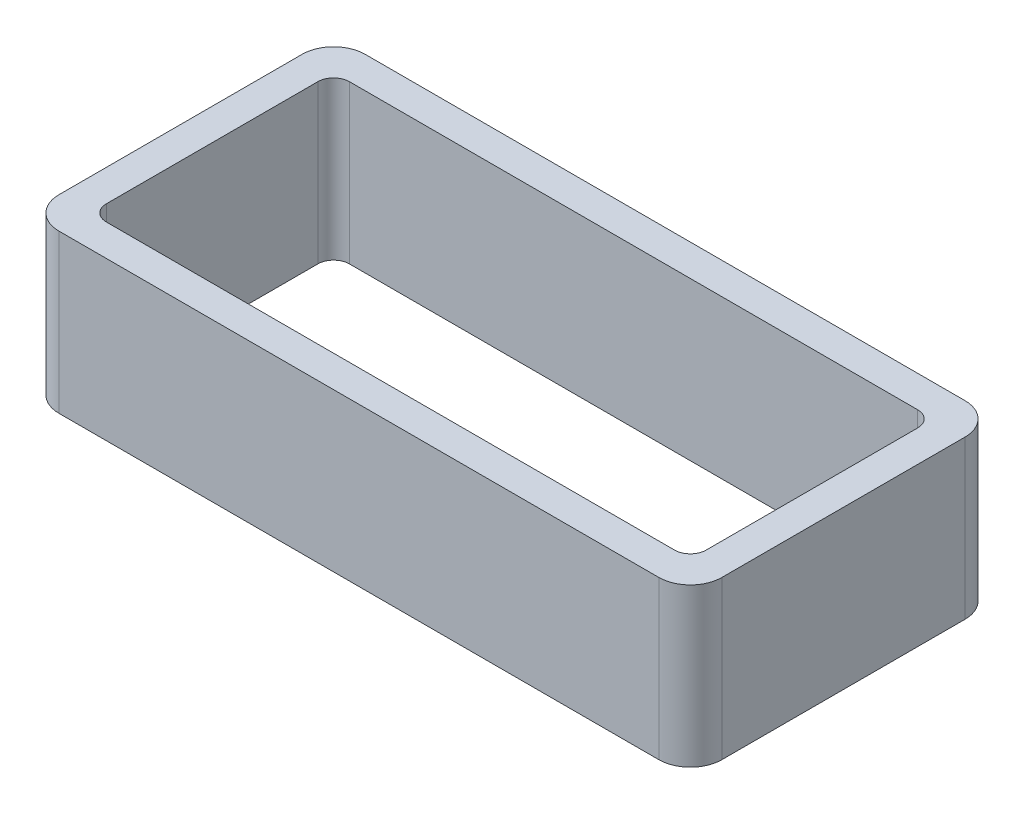
ISO-10303-21;
HEADER;
FILE_DESCRIPTION(('STEP AP214'),'2;1');
FILE_NAME('part.step','',(''),(''),'','','');
FILE_SCHEMA(('AUTOMOTIVE_DESIGN { 1 0 10303 214 1 1 1 1 }'));
ENDSEC;
DATA;
#1=APPLICATION_CONTEXT('core data for automotive mechanical design processes');
#2=APPLICATION_PROTOCOL_DEFINITION('international standard','automotive_design',2000,#1);
#3=PRODUCT_CONTEXT('',#1,'mechanical');
#4=PRODUCT('Part','Part','',(#3));
#5=PRODUCT_RELATED_PRODUCT_CATEGORY('part','',(#4));
#6=PRODUCT_DEFINITION_FORMATION('','',#4);
#7=PRODUCT_DEFINITION_CONTEXT('part definition',#1,'design');
#8=PRODUCT_DEFINITION('design','',#6,#7);
#9=PRODUCT_DEFINITION_SHAPE('','',#8);
#10=(LENGTH_UNIT() NAMED_UNIT(*) SI_UNIT(.MILLI.,.METRE.));
#11=(NAMED_UNIT(*) PLANE_ANGLE_UNIT() SI_UNIT($,.RADIAN.));
#12=(NAMED_UNIT(*) SI_UNIT($,.STERADIAN.) SOLID_ANGLE_UNIT());
#13=UNCERTAINTY_MEASURE_WITH_UNIT(LENGTH_MEASURE(1.E-05),#10,'distance_accuracy_value','');
#14=(GEOMETRIC_REPRESENTATION_CONTEXT(3) GLOBAL_UNCERTAINTY_ASSIGNED_CONTEXT((#13)) GLOBAL_UNIT_ASSIGNED_CONTEXT((#10,
#11,#12)) REPRESENTATION_CONTEXT('',''));
#15=CARTESIAN_POINT('',(0.,0.,0.));
#16=DIRECTION('',(0.,0.,1.));
#17=DIRECTION('',(1.,0.,0.));
#18=AXIS2_PLACEMENT_3D('',#15,#16,#17);
#19=CARTESIAN_POINT('',(9.5,5.,-3.85));
#20=DIRECTION('',(0.,-1.,0.));
#21=DIRECTION('',(0.,0.,-1.));
#22=AXIS2_PLACEMENT_3D('',#19,#20,#21);
#23=PLANE('',#22);
#24=CARTESIAN_POINT('',(9.5,5.,-3.85));
#25=DIRECTION('',(0.,1.,0.));
#26=DIRECTION('',(0.,0.,-1.));
#27=AXIS2_PLACEMENT_3D('',#24,#25,#26);
#28=CIRCLE('',#27,1.);
#29=CARTESIAN_POINT('',(10.5,5.,-3.84999999999999));
#30=VERTEX_POINT('',#29);
#31=CARTESIAN_POINT('',(9.49999999999999,5.,-4.85));
#32=VERTEX_POINT('',#31);
#33=EDGE_CURVE('E213',#30,#32,#28,.T.);
#34=ORIENTED_EDGE('',*,*,#33,.T.);
#35=DIRECTION('',(-1.,0.,0.));
#36=VECTOR('',#35,1.);
#37=CARTESIAN_POINT('',(-9.49999999999999,5.,-4.85));
#38=LINE('',#37,#36);
#39=CARTESIAN_POINT('',(-9.49999999999999,5.,-4.85));
#40=VERTEX_POINT('',#39);
#41=EDGE_CURVE('E216',#32,#40,#38,.T.);
#42=ORIENTED_EDGE('',*,*,#41,.T.);
#43=CARTESIAN_POINT('',(-9.5,5.,-3.85));
#44=DIRECTION('',(0.,1.,0.));
#45=DIRECTION('',(0.,0.,-1.));
#46=AXIS2_PLACEMENT_3D('',#43,#44,#45);
#47=CIRCLE('',#46,1.);
#48=CARTESIAN_POINT('',(-10.5,5.,-3.84999999999999));
#49=VERTEX_POINT('',#48);
#50=EDGE_CURVE('E219',#40,#49,#47,.T.);
#51=ORIENTED_EDGE('',*,*,#50,.T.);
#52=DIRECTION('',(0.,0.,1.));
#53=VECTOR('',#52,1.);
#54=CARTESIAN_POINT('',(-10.5,5.,-3.84999999999999));
#55=LINE('',#54,#53);
#56=CARTESIAN_POINT('',(-10.5,5.,3.84999999999999));
#57=VERTEX_POINT('',#56);
#58=EDGE_CURVE('E221',#49,#57,#55,.T.);
#59=ORIENTED_EDGE('',*,*,#58,.T.);
#60=CARTESIAN_POINT('',(-9.5,5.,3.85));
#61=DIRECTION('',(0.,1.,0.));
#62=DIRECTION('',(0.,0.,-1.));
#63=AXIS2_PLACEMENT_3D('',#60,#61,#62);
#64=CIRCLE('',#63,1.);
#65=CARTESIAN_POINT('',(-9.49999999999999,5.,4.85));
#66=VERTEX_POINT('',#65);
#67=EDGE_CURVE('E223',#57,#66,#64,.T.);
#68=ORIENTED_EDGE('',*,*,#67,.T.);
#69=DIRECTION('',(1.,0.,0.));
#70=VECTOR('',#69,1.);
#71=CARTESIAN_POINT('',(-9.49999999999999,5.,4.85));
#72=LINE('',#71,#70);
#73=CARTESIAN_POINT('',(9.49999999999999,5.,4.85));
#74=VERTEX_POINT('',#73);
#75=EDGE_CURVE('E225',#66,#74,#72,.T.);
#76=ORIENTED_EDGE('',*,*,#75,.T.);
#77=CARTESIAN_POINT('',(9.5,5.,3.85));
#78=DIRECTION('',(0.,1.,0.));
#79=DIRECTION('',(0.,0.,-1.));
#80=AXIS2_PLACEMENT_3D('',#77,#78,#79);
#81=CIRCLE('',#80,1.);
#82=CARTESIAN_POINT('',(10.5,5.,3.84999999999999));
#83=VERTEX_POINT('',#82);
#84=EDGE_CURVE('E227',#74,#83,#81,.T.);
#85=ORIENTED_EDGE('',*,*,#84,.T.);
#86=DIRECTION('',(0.,0.,-1.));
#87=VECTOR('',#86,1.);
#88=CARTESIAN_POINT('',(10.5,5.,-3.84999999999999));
#89=LINE('',#88,#87);
#90=EDGE_CURVE('E229',#83,#30,#89,.T.);
#91=ORIENTED_EDGE('',*,*,#90,.T.);
#92=EDGE_LOOP('',(#34,#42,#51,#59,#68,#76,#85,#91));
#93=FACE_BOUND('',#92,.T.);
#94=CARTESIAN_POINT('',(9.,5.,-3.35));
#95=DIRECTION('',(0.,1.,0.));
#96=DIRECTION('',(0.,0.,-1.));
#97=AXIS2_PLACEMENT_3D('',#94,#95,#96);
#98=CIRCLE('',#97,0.5);
#99=CARTESIAN_POINT('',(9.5,5.,-3.35));
#100=VERTEX_POINT('',#99);
#101=CARTESIAN_POINT('',(8.99999999999999,5.,-3.85));
#102=VERTEX_POINT('',#101);
#103=EDGE_CURVE('E148',#100,#102,#98,.T.);
#104=ORIENTED_EDGE('',*,*,#103,.F.);
#105=DIRECTION('',(0.,0.,-1.));
#106=VECTOR('',#105,1.);
#107=CARTESIAN_POINT('',(9.5,5.,-3.35));
#108=LINE('',#107,#106);
#109=CARTESIAN_POINT('',(9.5,5.,3.35));
#110=VERTEX_POINT('',#109);
#111=EDGE_CURVE('E181',#110,#100,#108,.T.);
#112=ORIENTED_EDGE('',*,*,#111,.F.);
#113=CARTESIAN_POINT('',(9.,5.,3.35));
#114=DIRECTION('',(0.,1.,0.));
#115=DIRECTION('',(0.,0.,-1.));
#116=AXIS2_PLACEMENT_3D('',#113,#114,#115);
#117=CIRCLE('',#116,0.5);
#118=CARTESIAN_POINT('',(8.99999999999999,5.,3.85));
#119=VERTEX_POINT('',#118);
#120=EDGE_CURVE('E179',#119,#110,#117,.T.);
#121=ORIENTED_EDGE('',*,*,#120,.F.);
#122=DIRECTION('',(1.,0.,0.));
#123=VECTOR('',#122,1.);
#124=CARTESIAN_POINT('',(-9.,5.,3.85));
#125=LINE('',#124,#123);
#126=CARTESIAN_POINT('',(-9.,5.,3.85));
#127=VERTEX_POINT('',#126);
#128=EDGE_CURVE('E177',#127,#119,#125,.T.);
#129=ORIENTED_EDGE('',*,*,#128,.F.);
#130=CARTESIAN_POINT('',(-9.,5.,3.35));
#131=DIRECTION('',(0.,1.,0.));
#132=DIRECTION('',(0.,0.,-1.));
#133=AXIS2_PLACEMENT_3D('',#130,#131,#132);
#134=CIRCLE('',#133,0.5);
#135=CARTESIAN_POINT('',(-9.5,5.,3.35));
#136=VERTEX_POINT('',#135);
#137=EDGE_CURVE('E175',#136,#127,#134,.T.);
#138=ORIENTED_EDGE('',*,*,#137,.F.);
#139=DIRECTION('',(0.,0.,1.));
#140=VECTOR('',#139,1.);
#141=CARTESIAN_POINT('',(-9.5,5.,-3.35));
#142=LINE('',#141,#140);
#143=CARTESIAN_POINT('',(-9.5,5.,-3.35));
#144=VERTEX_POINT('',#143);
#145=EDGE_CURVE('E171',#144,#136,#142,.T.);
#146=ORIENTED_EDGE('',*,*,#145,.F.);
#147=CARTESIAN_POINT('',(-9.,5.,-3.35));
#148=DIRECTION('',(0.,1.,0.));
#149=DIRECTION('',(0.,0.,-1.));
#150=AXIS2_PLACEMENT_3D('',#147,#148,#149);
#151=CIRCLE('',#150,0.5);
#152=CARTESIAN_POINT('',(-9.,5.,-3.85));
#153=VERTEX_POINT('',#152);
#154=EDGE_CURVE('E169',#153,#144,#151,.T.);
#155=ORIENTED_EDGE('',*,*,#154,.F.);
#156=DIRECTION('',(-1.,0.,0.));
#157=VECTOR('',#156,1.);
#158=CARTESIAN_POINT('',(-9.,5.,-3.85));
#159=LINE('',#158,#157);
#160=EDGE_CURVE('E156',#102,#153,#159,.T.);
#161=ORIENTED_EDGE('',*,*,#160,.F.);
#162=EDGE_LOOP('',(#104,#112,#121,#129,#138,#146,#155,#161));
#163=FACE_BOUND('',#162,.T.);
#164=ADVANCED_FACE('F35',(#93,#163),#23,.F.);
#165=CARTESIAN_POINT('',(9.5,0.,-3.85));
#166=DIRECTION('',(0.,-1.,0.));
#167=DIRECTION('',(0.,0.,-1.));
#168=AXIS2_PLACEMENT_3D('',#165,#166,#167);
#169=PLANE('',#168);
#170=CARTESIAN_POINT('',(9.5,0.,-3.85));
#171=DIRECTION('',(0.,1.,0.));
#172=DIRECTION('',(0.,0.,-1.));
#173=AXIS2_PLACEMENT_3D('',#170,#171,#172);
#174=CIRCLE('',#173,1.);
#175=CARTESIAN_POINT('',(10.5,0.,-3.84999999999999));
#176=VERTEX_POINT('',#175);
#177=CARTESIAN_POINT('',(9.49999999999999,0.,-4.85));
#178=VERTEX_POINT('',#177);
#179=EDGE_CURVE('E164',#176,#178,#174,.T.);
#180=ORIENTED_EDGE('',*,*,#179,.F.);
#181=DIRECTION('',(0.,0.,-1.));
#182=VECTOR('',#181,1.);
#183=CARTESIAN_POINT('',(10.5,0.,-3.84999999999999));
#184=LINE('',#183,#182);
#185=CARTESIAN_POINT('',(10.5,0.,3.84999999999999));
#186=VERTEX_POINT('',#185);
#187=EDGE_CURVE('E217',#186,#176,#184,.T.);
#188=ORIENTED_EDGE('',*,*,#187,.F.);
#189=CARTESIAN_POINT('',(9.5,0.,3.85));
#190=DIRECTION('',(0.,1.,0.));
#191=DIRECTION('',(0.,0.,-1.));
#192=AXIS2_PLACEMENT_3D('',#189,#190,#191);
#193=CIRCLE('',#192,1.);
#194=CARTESIAN_POINT('',(9.49999999999999,0.,4.85));
#195=VERTEX_POINT('',#194);
#196=EDGE_CURVE('E244',#195,#186,#193,.T.);
#197=ORIENTED_EDGE('',*,*,#196,.F.);
#198=DIRECTION('',(1.,0.,0.));
#199=VECTOR('',#198,1.);
#200=CARTESIAN_POINT('',(-9.49999999999999,0.,4.85));
#201=LINE('',#200,#199);
#202=CARTESIAN_POINT('',(-9.49999999999999,0.,4.85));
#203=VERTEX_POINT('',#202);
#204=EDGE_CURVE('E242',#203,#195,#201,.T.);
#205=ORIENTED_EDGE('',*,*,#204,.F.);
#206=CARTESIAN_POINT('',(-9.5,0.,3.85));
#207=DIRECTION('',(0.,1.,0.));
#208=DIRECTION('',(0.,0.,-1.));
#209=AXIS2_PLACEMENT_3D('',#206,#207,#208);
#210=CIRCLE('',#209,1.);
#211=CARTESIAN_POINT('',(-10.5,0.,3.84999999999999));
#212=VERTEX_POINT('',#211);
#213=EDGE_CURVE('E240',#212,#203,#210,.T.);
#214=ORIENTED_EDGE('',*,*,#213,.F.);
#215=DIRECTION('',(0.,0.,1.));
#216=VECTOR('',#215,1.);
#217=CARTESIAN_POINT('',(-10.5,0.,-3.84999999999999));
#218=LINE('',#217,#216);
#219=CARTESIAN_POINT('',(-10.5,0.,-3.84999999999999));
#220=VERTEX_POINT('',#219);
#221=EDGE_CURVE('E238',#220,#212,#218,.T.);
#222=ORIENTED_EDGE('',*,*,#221,.F.);
#223=CARTESIAN_POINT('',(-9.5,0.,-3.85));
#224=DIRECTION('',(0.,1.,0.));
#225=DIRECTION('',(0.,0.,-1.));
#226=AXIS2_PLACEMENT_3D('',#223,#224,#225);
#227=CIRCLE('',#226,1.);
#228=CARTESIAN_POINT('',(-9.49999999999999,0.,-4.85));
#229=VERTEX_POINT('',#228);
#230=EDGE_CURVE('E236',#229,#220,#227,.T.);
#231=ORIENTED_EDGE('',*,*,#230,.F.);
#232=DIRECTION('',(-1.,0.,0.));
#233=VECTOR('',#232,1.);
#234=CARTESIAN_POINT('',(-9.49999999999999,0.,-4.85));
#235=LINE('',#234,#233);
#236=EDGE_CURVE('E234',#178,#229,#235,.T.);
#237=ORIENTED_EDGE('',*,*,#236,.F.);
#238=EDGE_LOOP('',(#180,#188,#197,#205,#214,#222,#231,#237));
#239=FACE_BOUND('',#238,.T.);
#240=DIRECTION('',(0.,0.,-1.));
#241=VECTOR('',#240,1.);
#242=CARTESIAN_POINT('',(9.5,0.,-3.35));
#243=LINE('',#242,#241);
#244=CARTESIAN_POINT('',(9.5,0.,3.35));
#245=VERTEX_POINT('',#244);
#246=CARTESIAN_POINT('',(9.5,0.,-3.35));
#247=VERTEX_POINT('',#246);
#248=EDGE_CURVE('E157',#245,#247,#243,.T.);
#249=ORIENTED_EDGE('',*,*,#248,.T.);
#250=CARTESIAN_POINT('',(9.,0.,-3.35));
#251=DIRECTION('',(0.,1.,0.));
#252=DIRECTION('',(0.,0.,-1.));
#253=AXIS2_PLACEMENT_3D('',#250,#251,#252);
#254=CIRCLE('',#253,0.5);
#255=CARTESIAN_POINT('',(8.99999999999999,0.,-3.85));
#256=VERTEX_POINT('',#255);
#257=EDGE_CURVE('E58',#247,#256,#254,.T.);
#258=ORIENTED_EDGE('',*,*,#257,.T.);
#259=DIRECTION('',(-1.,0.,0.));
#260=VECTOR('',#259,1.);
#261=CARTESIAN_POINT('',(-9.,0.,-3.85));
#262=LINE('',#261,#260);
#263=CARTESIAN_POINT('',(-9.,0.,-3.85));
#264=VERTEX_POINT('',#263);
#265=EDGE_CURVE('E163',#256,#264,#262,.T.);
#266=ORIENTED_EDGE('',*,*,#265,.T.);
#267=CARTESIAN_POINT('',(-9.,0.,-3.35));
#268=DIRECTION('',(0.,1.,0.));
#269=DIRECTION('',(0.,0.,-1.));
#270=AXIS2_PLACEMENT_3D('',#267,#268,#269);
#271=CIRCLE('',#270,0.5);
#272=CARTESIAN_POINT('',(-9.5,0.,-3.35));
#273=VERTEX_POINT('',#272);
#274=EDGE_CURVE('E185',#264,#273,#271,.T.);
#275=ORIENTED_EDGE('',*,*,#274,.T.);
#276=DIRECTION('',(0.,0.,1.));
#277=VECTOR('',#276,1.);
#278=CARTESIAN_POINT('',(-9.5,0.,-3.35));
#279=LINE('',#278,#277);
#280=CARTESIAN_POINT('',(-9.5,0.,3.35));
#281=VERTEX_POINT('',#280);
#282=EDGE_CURVE('E188',#273,#281,#279,.T.);
#283=ORIENTED_EDGE('',*,*,#282,.T.);
#284=CARTESIAN_POINT('',(-9.,0.,3.35));
#285=DIRECTION('',(0.,1.,0.));
#286=DIRECTION('',(0.,0.,-1.));
#287=AXIS2_PLACEMENT_3D('',#284,#285,#286);
#288=CIRCLE('',#287,0.5);
#289=CARTESIAN_POINT('',(-9.,0.,3.85));
#290=VERTEX_POINT('',#289);
#291=EDGE_CURVE('E191',#281,#290,#288,.T.);
#292=ORIENTED_EDGE('',*,*,#291,.T.);
#293=DIRECTION('',(1.,0.,0.));
#294=VECTOR('',#293,1.);
#295=CARTESIAN_POINT('',(-9.,0.,3.85));
#296=LINE('',#295,#294);
#297=CARTESIAN_POINT('',(8.99999999999999,0.,3.85));
#298=VERTEX_POINT('',#297);
#299=EDGE_CURVE('E194',#290,#298,#296,.T.);
#300=ORIENTED_EDGE('',*,*,#299,.T.);
#301=CARTESIAN_POINT('',(9.,0.,3.35));
#302=DIRECTION('',(0.,1.,0.));
#303=DIRECTION('',(0.,0.,-1.));
#304=AXIS2_PLACEMENT_3D('',#301,#302,#303);
#305=CIRCLE('',#304,0.5);
#306=EDGE_CURVE('E197',#298,#245,#305,.T.);
#307=ORIENTED_EDGE('',*,*,#306,.T.);
#308=EDGE_LOOP('',(#249,#258,#266,#275,#283,#292,#300,#307));
#309=FACE_BOUND('',#308,.T.);
#310=ADVANCED_FACE('F274',(#239,#309),#169,.T.);
#311=CARTESIAN_POINT('',(9.5,5.,-3.85));
#312=DIRECTION('',(0.,-1.,0.));
#313=DIRECTION('',(0.,0.,-1.));
#314=AXIS2_PLACEMENT_3D('',#311,#312,#313);
#315=CYLINDRICAL_SURFACE('',#314,1.);
#316=ORIENTED_EDGE('',*,*,#179,.T.);
#317=DIRECTION('',(0.,-1.,0.));
#318=VECTOR('',#317,1.);
#319=CARTESIAN_POINT('',(9.49999999999999,5.,-4.85));
#320=LINE('',#319,#318);
#321=EDGE_CURVE('E11',#32,#178,#320,.T.);
#322=ORIENTED_EDGE('',*,*,#321,.F.);
#323=ORIENTED_EDGE('',*,*,#33,.F.);
#324=DIRECTION('',(0.,-1.,0.));
#325=VECTOR('',#324,1.);
#326=CARTESIAN_POINT('',(10.5,5.,-3.84999999999999));
#327=LINE('',#326,#325);
#328=EDGE_CURVE('E231',#30,#176,#327,.T.);
#329=ORIENTED_EDGE('',*,*,#328,.T.);
#330=EDGE_LOOP('',(#316,#322,#323,#329));
#331=FACE_BOUND('',#330,.T.);
#332=ADVANCED_FACE('F37',(#331),#315,.T.);
#333=CARTESIAN_POINT('',(-9.49999999999999,5.,-4.85));
#334=DIRECTION('',(0.,0.,1.));
#335=DIRECTION('',(1.,0.,0.));
#336=AXIS2_PLACEMENT_3D('',#333,#334,#335);
#337=PLANE('',#336);
#338=ORIENTED_EDGE('',*,*,#236,.T.);
#339=DIRECTION('',(0.,-1.,0.));
#340=VECTOR('',#339,1.);
#341=CARTESIAN_POINT('',(-9.49999999999999,5.,-4.85));
#342=LINE('',#341,#340);
#343=EDGE_CURVE('E43',#40,#229,#342,.T.);
#344=ORIENTED_EDGE('',*,*,#343,.F.);
#345=ORIENTED_EDGE('',*,*,#41,.F.);
#346=ORIENTED_EDGE('',*,*,#321,.T.);
#347=EDGE_LOOP('',(#338,#344,#345,#346));
#348=FACE_BOUND('',#347,.T.);
#349=ADVANCED_FACE('F291',(#348),#337,.F.);
#350=CARTESIAN_POINT('',(-9.5,5.,-3.85));
#351=DIRECTION('',(0.,-1.,0.));
#352=DIRECTION('',(0.,0.,-1.));
#353=AXIS2_PLACEMENT_3D('',#350,#351,#352);
#354=CYLINDRICAL_SURFACE('',#353,1.);
#355=ORIENTED_EDGE('',*,*,#230,.T.);
#356=DIRECTION('',(0.,-1.,0.));
#357=VECTOR('',#356,1.);
#358=CARTESIAN_POINT('',(-10.5,5.,-3.84999999999999));
#359=LINE('',#358,#357);
#360=EDGE_CURVE('E261',#49,#220,#359,.T.);
#361=ORIENTED_EDGE('',*,*,#360,.F.);
#362=ORIENTED_EDGE('',*,*,#50,.F.);
#363=ORIENTED_EDGE('',*,*,#343,.T.);
#364=EDGE_LOOP('',(#355,#361,#362,#363));
#365=FACE_BOUND('',#364,.T.);
#366=ADVANCED_FACE('F268',(#365),#354,.T.);
#367=CARTESIAN_POINT('',(-10.5,5.,-3.84999999999999));
#368=DIRECTION('',(1.,0.,0.));
#369=DIRECTION('',(0.,0.,-1.));
#370=AXIS2_PLACEMENT_3D('',#367,#368,#369);
#371=PLANE('',#370);
#372=ORIENTED_EDGE('',*,*,#221,.T.);
#373=DIRECTION('',(0.,-1.,0.));
#374=VECTOR('',#373,1.);
#375=CARTESIAN_POINT('',(-10.5,5.,3.84999999999999));
#376=LINE('',#375,#374);
#377=EDGE_CURVE('E258',#57,#212,#376,.T.);
#378=ORIENTED_EDGE('',*,*,#377,.F.);
#379=ORIENTED_EDGE('',*,*,#58,.F.);
#380=ORIENTED_EDGE('',*,*,#360,.T.);
#381=EDGE_LOOP('',(#372,#378,#379,#380));
#382=FACE_BOUND('',#381,.T.);
#383=ADVANCED_FACE('F280',(#382),#371,.F.);
#384=CARTESIAN_POINT('',(-9.5,5.,3.85));
#385=DIRECTION('',(0.,-1.,0.));
#386=DIRECTION('',(0.,0.,-1.));
#387=AXIS2_PLACEMENT_3D('',#384,#385,#386);
#388=CYLINDRICAL_SURFACE('',#387,1.);
#389=ORIENTED_EDGE('',*,*,#213,.T.);
#390=DIRECTION('',(0.,-1.,0.));
#391=VECTOR('',#390,1.);
#392=CARTESIAN_POINT('',(-9.49999999999999,5.,4.85));
#393=LINE('',#392,#391);
#394=EDGE_CURVE('E255',#66,#203,#393,.T.);
#395=ORIENTED_EDGE('',*,*,#394,.F.);
#396=ORIENTED_EDGE('',*,*,#67,.F.);
#397=ORIENTED_EDGE('',*,*,#377,.T.);
#398=EDGE_LOOP('',(#389,#395,#396,#397));
#399=FACE_BOUND('',#398,.T.);
#400=ADVANCED_FACE('F284',(#399),#388,.T.);
#401=CARTESIAN_POINT('',(-9.49999999999999,5.,4.85));
#402=DIRECTION('',(0.,0.,-1.));
#403=DIRECTION('',(-1.,0.,0.));
#404=AXIS2_PLACEMENT_3D('',#401,#402,#403);
#405=PLANE('',#404);
#406=ORIENTED_EDGE('',*,*,#204,.T.);
#407=DIRECTION('',(0.,-1.,0.));
#408=VECTOR('',#407,1.);
#409=CARTESIAN_POINT('',(9.49999999999999,5.,4.85));
#410=LINE('',#409,#408);
#411=EDGE_CURVE('E252',#74,#195,#410,.T.);
#412=ORIENTED_EDGE('',*,*,#411,.F.);
#413=ORIENTED_EDGE('',*,*,#75,.F.);
#414=ORIENTED_EDGE('',*,*,#394,.T.);
#415=EDGE_LOOP('',(#406,#412,#413,#414));
#416=FACE_BOUND('',#415,.T.);
#417=ADVANCED_FACE('F304',(#416),#405,.F.);
#418=CARTESIAN_POINT('',(9.5,5.,3.85));
#419=DIRECTION('',(0.,-1.,0.));
#420=DIRECTION('',(0.,0.,-1.));
#421=AXIS2_PLACEMENT_3D('',#418,#419,#420);
#422=CYLINDRICAL_SURFACE('',#421,1.);
#423=ORIENTED_EDGE('',*,*,#196,.T.);
#424=DIRECTION('',(0.,-1.,0.));
#425=VECTOR('',#424,1.);
#426=CARTESIAN_POINT('',(10.5,5.,3.84999999999999));
#427=LINE('',#426,#425);
#428=EDGE_CURVE('E249',#83,#186,#427,.T.);
#429=ORIENTED_EDGE('',*,*,#428,.F.);
#430=ORIENTED_EDGE('',*,*,#84,.F.);
#431=ORIENTED_EDGE('',*,*,#411,.T.);
#432=EDGE_LOOP('',(#423,#429,#430,#431));
#433=FACE_BOUND('',#432,.T.);
#434=ADVANCED_FACE('F302',(#433),#422,.T.);
#435=CARTESIAN_POINT('',(10.5,5.,-3.84999999999999));
#436=DIRECTION('',(-1.,0.,0.));
#437=DIRECTION('',(0.,0.,1.));
#438=AXIS2_PLACEMENT_3D('',#435,#436,#437);
#439=PLANE('',#438);
#440=ORIENTED_EDGE('',*,*,#187,.T.);
#441=ORIENTED_EDGE('',*,*,#328,.F.);
#442=ORIENTED_EDGE('',*,*,#90,.F.);
#443=ORIENTED_EDGE('',*,*,#428,.T.);
#444=EDGE_LOOP('',(#440,#441,#442,#443));
#445=FACE_BOUND('',#444,.T.);
#446=ADVANCED_FACE('F297',(#445),#439,.F.);
#447=CARTESIAN_POINT('',(9.,5.,-3.35));
#448=DIRECTION('',(0.,-1.,0.));
#449=DIRECTION('',(0.,0.,-1.));
#450=AXIS2_PLACEMENT_3D('',#447,#448,#449);
#451=CYLINDRICAL_SURFACE('',#450,0.5);
#452=ORIENTED_EDGE('',*,*,#257,.F.);
#453=DIRECTION('',(0.,-1.,0.));
#454=VECTOR('',#453,1.);
#455=CARTESIAN_POINT('',(9.5,5.,-3.35));
#456=LINE('',#455,#454);
#457=EDGE_CURVE('E152',#100,#247,#456,.T.);
#458=ORIENTED_EDGE('',*,*,#457,.F.);
#459=ORIENTED_EDGE('',*,*,#103,.T.);
#460=DIRECTION('',(0.,-1.,0.));
#461=VECTOR('',#460,1.);
#462=CARTESIAN_POINT('',(8.99999999999999,5.,-3.85));
#463=LINE('',#462,#461);
#464=EDGE_CURVE('E151',#102,#256,#463,.T.);
#465=ORIENTED_EDGE('',*,*,#464,.T.);
#466=EDGE_LOOP('',(#452,#458,#459,#465));
#467=FACE_BOUND('',#466,.T.);
#468=ADVANCED_FACE('F150',(#467),#451,.F.);
#469=CARTESIAN_POINT('',(-9.,5.,-3.85));
#470=DIRECTION('',(0.,0.,1.));
#471=DIRECTION('',(1.,0.,0.));
#472=AXIS2_PLACEMENT_3D('',#469,#470,#471);
#473=PLANE('',#472);
#474=ORIENTED_EDGE('',*,*,#265,.F.);
#475=ORIENTED_EDGE('',*,*,#464,.F.);
#476=ORIENTED_EDGE('',*,*,#160,.T.);
#477=DIRECTION('',(0.,-1.,0.));
#478=VECTOR('',#477,1.);
#479=CARTESIAN_POINT('',(-9.,5.,-3.85));
#480=LINE('',#479,#478);
#481=EDGE_CURVE('E165',#153,#264,#480,.T.);
#482=ORIENTED_EDGE('',*,*,#481,.T.);
#483=EDGE_LOOP('',(#474,#475,#476,#482));
#484=FACE_BOUND('',#483,.T.);
#485=ADVANCED_FACE('F160',(#484),#473,.T.);
#486=CARTESIAN_POINT('',(-9.,5.,-3.35));
#487=DIRECTION('',(0.,-1.,0.));
#488=DIRECTION('',(0.,0.,-1.));
#489=AXIS2_PLACEMENT_3D('',#486,#487,#488);
#490=CYLINDRICAL_SURFACE('',#489,0.5);
#491=ORIENTED_EDGE('',*,*,#274,.F.);
#492=ORIENTED_EDGE('',*,*,#481,.F.);
#493=ORIENTED_EDGE('',*,*,#154,.T.);
#494=DIRECTION('',(0.,-1.,0.));
#495=VECTOR('',#494,1.);
#496=CARTESIAN_POINT('',(-9.5,5.,-3.35));
#497=LINE('',#496,#495);
#498=EDGE_CURVE('E210',#144,#273,#497,.T.);
#499=ORIENTED_EDGE('',*,*,#498,.T.);
#500=EDGE_LOOP('',(#491,#492,#493,#499));
#501=FACE_BOUND('',#500,.T.);
#502=ADVANCED_FACE('F329',(#501),#490,.F.);
#503=CARTESIAN_POINT('',(-9.5,5.,-3.35));
#504=DIRECTION('',(1.,0.,0.));
#505=DIRECTION('',(0.,0.,-1.));
#506=AXIS2_PLACEMENT_3D('',#503,#504,#505);
#507=PLANE('',#506);
#508=ORIENTED_EDGE('',*,*,#282,.F.);
#509=ORIENTED_EDGE('',*,*,#498,.F.);
#510=ORIENTED_EDGE('',*,*,#145,.T.);
#511=DIRECTION('',(0.,-1.,0.));
#512=VECTOR('',#511,1.);
#513=CARTESIAN_POINT('',(-9.5,5.,3.35));
#514=LINE('',#513,#512);
#515=EDGE_CURVE('E208',#136,#281,#514,.T.);
#516=ORIENTED_EDGE('',*,*,#515,.T.);
#517=EDGE_LOOP('',(#508,#509,#510,#516));
#518=FACE_BOUND('',#517,.T.);
#519=ADVANCED_FACE('F333',(#518),#507,.T.);
#520=CARTESIAN_POINT('',(-9.,5.,3.35));
#521=DIRECTION('',(0.,-1.,0.));
#522=DIRECTION('',(0.,0.,-1.));
#523=AXIS2_PLACEMENT_3D('',#520,#521,#522);
#524=CYLINDRICAL_SURFACE('',#523,0.5);
#525=ORIENTED_EDGE('',*,*,#291,.F.);
#526=ORIENTED_EDGE('',*,*,#515,.F.);
#527=ORIENTED_EDGE('',*,*,#137,.T.);
#528=DIRECTION('',(0.,-1.,0.));
#529=VECTOR('',#528,1.);
#530=CARTESIAN_POINT('',(-9.,5.,3.85));
#531=LINE('',#530,#529);
#532=EDGE_CURVE('E206',#127,#290,#531,.T.);
#533=ORIENTED_EDGE('',*,*,#532,.T.);
#534=EDGE_LOOP('',(#525,#526,#527,#533));
#535=FACE_BOUND('',#534,.T.);
#536=ADVANCED_FACE('F339',(#535),#524,.F.);
#537=CARTESIAN_POINT('',(-9.,5.,3.85));
#538=DIRECTION('',(0.,0.,-1.));
#539=DIRECTION('',(-1.,0.,0.));
#540=AXIS2_PLACEMENT_3D('',#537,#538,#539);
#541=PLANE('',#540);
#542=ORIENTED_EDGE('',*,*,#299,.F.);
#543=ORIENTED_EDGE('',*,*,#532,.F.);
#544=ORIENTED_EDGE('',*,*,#128,.T.);
#545=DIRECTION('',(0.,-1.,0.));
#546=VECTOR('',#545,1.);
#547=CARTESIAN_POINT('',(8.99999999999999,5.,3.85));
#548=LINE('',#547,#546);
#549=EDGE_CURVE('E204',#119,#298,#548,.T.);
#550=ORIENTED_EDGE('',*,*,#549,.T.);
#551=EDGE_LOOP('',(#542,#543,#544,#550));
#552=FACE_BOUND('',#551,.T.);
#553=ADVANCED_FACE('F343',(#552),#541,.T.);
#554=CARTESIAN_POINT('',(9.,5.,3.35));
#555=DIRECTION('',(0.,-1.,0.));
#556=DIRECTION('',(0.,0.,-1.));
#557=AXIS2_PLACEMENT_3D('',#554,#555,#556);
#558=CYLINDRICAL_SURFACE('',#557,0.5);
#559=ORIENTED_EDGE('',*,*,#306,.F.);
#560=ORIENTED_EDGE('',*,*,#549,.F.);
#561=ORIENTED_EDGE('',*,*,#120,.T.);
#562=DIRECTION('',(0.,-1.,0.));
#563=VECTOR('',#562,1.);
#564=CARTESIAN_POINT('',(9.5,5.,3.35));
#565=LINE('',#564,#563);
#566=EDGE_CURVE('E50',#110,#245,#565,.T.);
#567=ORIENTED_EDGE('',*,*,#566,.T.);
#568=EDGE_LOOP('',(#559,#560,#561,#567));
#569=FACE_BOUND('',#568,.T.);
#570=ADVANCED_FACE('F347',(#569),#558,.F.);
#571=CARTESIAN_POINT('',(9.5,5.,-3.35));
#572=DIRECTION('',(-1.,0.,0.));
#573=DIRECTION('',(0.,0.,1.));
#574=AXIS2_PLACEMENT_3D('',#571,#572,#573);
#575=PLANE('',#574);
#576=ORIENTED_EDGE('',*,*,#248,.F.);
#577=ORIENTED_EDGE('',*,*,#566,.F.);
#578=ORIENTED_EDGE('',*,*,#111,.T.);
#579=ORIENTED_EDGE('',*,*,#457,.T.);
#580=EDGE_LOOP('',(#576,#577,#578,#579));
#581=FACE_BOUND('',#580,.T.);
#582=ADVANCED_FACE('F351',(#581),#575,.T.);
#583=CLOSED_SHELL('',(#164,#310,#332,#349,#366,#383,#400,#417,#434,#446,#468,#485,#502,#519,
#536,#553,#570,#582));
#584=MANIFOLD_SOLID_BREP('B2',#583);
#585=ADVANCED_BREP_SHAPE_REPRESENTATION('',(#18,#584),#14);
#586=SHAPE_DEFINITION_REPRESENTATION(#9,#585);
ENDSEC;
END-ISO-10303-21;
